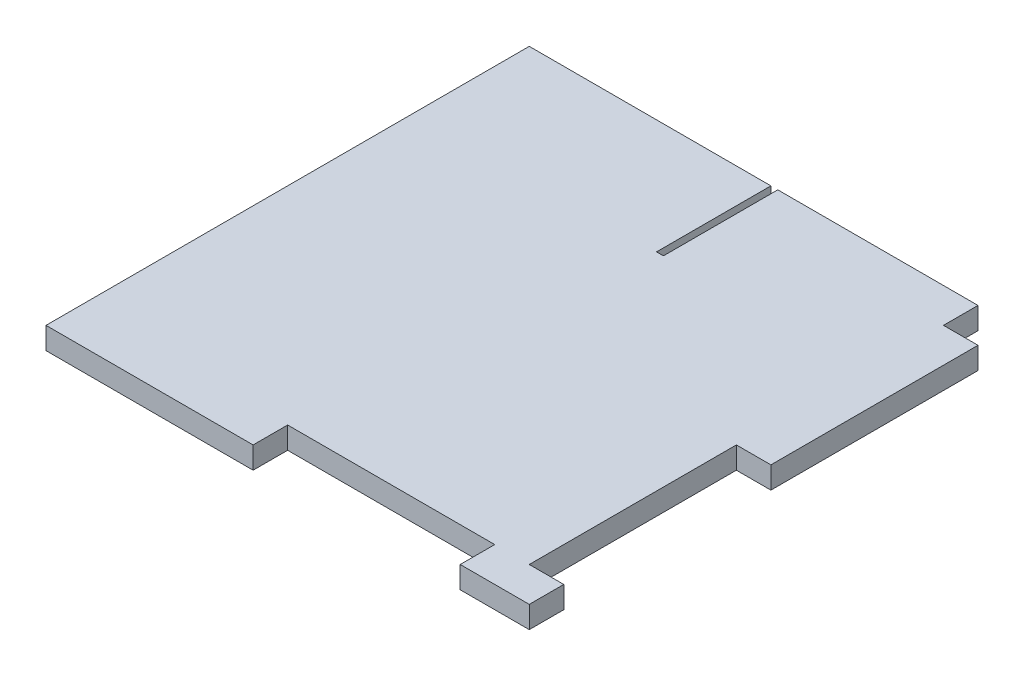
ISO-10303-21;
HEADER;
FILE_DESCRIPTION(('STEP AP214'),'2;1');
FILE_NAME('part.step','',(''),(''),'','','');
FILE_SCHEMA(('AUTOMOTIVE_DESIGN { 1 0 10303 214 1 1 1 1 }'));
ENDSEC;
DATA;
#1=APPLICATION_CONTEXT('core data for automotive mechanical design processes');
#2=APPLICATION_PROTOCOL_DEFINITION('international standard','automotive_design',2000,#1);
#3=PRODUCT_CONTEXT('',#1,'mechanical');
#4=PRODUCT('Part','Part','',(#3));
#5=PRODUCT_RELATED_PRODUCT_CATEGORY('part','',(#4));
#6=PRODUCT_DEFINITION_FORMATION('','',#4);
#7=PRODUCT_DEFINITION_CONTEXT('part definition',#1,'design');
#8=PRODUCT_DEFINITION('design','',#6,#7);
#9=PRODUCT_DEFINITION_SHAPE('','',#8);
#10=(LENGTH_UNIT() NAMED_UNIT(*) SI_UNIT(.MILLI.,.METRE.));
#11=(NAMED_UNIT(*) PLANE_ANGLE_UNIT() SI_UNIT($,.RADIAN.));
#12=(NAMED_UNIT(*) SI_UNIT($,.STERADIAN.) SOLID_ANGLE_UNIT());
#13=UNCERTAINTY_MEASURE_WITH_UNIT(LENGTH_MEASURE(1.E-05),#10,'distance_accuracy_value','');
#14=(GEOMETRIC_REPRESENTATION_CONTEXT(3) GLOBAL_UNCERTAINTY_ASSIGNED_CONTEXT((#13)) GLOBAL_UNIT_ASSIGNED_CONTEXT((#10,
#11,#12)) REPRESENTATION_CONTEXT('',''));
#15=CARTESIAN_POINT('',(0.,0.,0.));
#16=DIRECTION('',(0.,0.,1.));
#17=DIRECTION('',(1.,0.,0.));
#18=AXIS2_PLACEMENT_3D('',#15,#16,#17);
#19=CARTESIAN_POINT('',(35.,3.175,35.));
#20=DIRECTION('',(-1.,0.,0.));
#21=DIRECTION('',(0.,0.,1.));
#22=AXIS2_PLACEMENT_3D('',#19,#20,#21);
#23=PLANE('',#22);
#24=DIRECTION('',(0.,0.,-1.));
#25=VECTOR('',#24,1.);
#26=CARTESIAN_POINT('',(35.,3.175,35.));
#27=LINE('',#26,#25);
#28=CARTESIAN_POINT('',(35.,3.175,0.));
#29=VERTEX_POINT('',#28);
#30=CARTESIAN_POINT('',(35.,3.175,-30.));
#31=VERTEX_POINT('',#30);
#32=EDGE_CURVE('E202',#29,#31,#27,.T.);
#33=ORIENTED_EDGE('',*,*,#32,.F.);
#34=DIRECTION('',(0.,1.,0.));
#35=VECTOR('',#34,1.);
#36=CARTESIAN_POINT('',(35.,-6.825,0.));
#37=LINE('',#36,#35);
#38=CARTESIAN_POINT('',(35.,0.,0.));
#39=VERTEX_POINT('',#38);
#40=EDGE_CURVE('E250',#39,#29,#37,.T.);
#41=ORIENTED_EDGE('',*,*,#40,.F.);
#42=DIRECTION('',(0.,0.,-1.));
#43=VECTOR('',#42,1.);
#44=CARTESIAN_POINT('',(35.,0.,35.));
#45=LINE('',#44,#43);
#46=CARTESIAN_POINT('',(35.,0.,-30.));
#47=VERTEX_POINT('',#46);
#48=EDGE_CURVE('E193',#39,#47,#45,.T.);
#49=ORIENTED_EDGE('',*,*,#48,.T.);
#50=DIRECTION('',(0.,1.,0.));
#51=VECTOR('',#50,1.);
#52=CARTESIAN_POINT('',(35.,-6.825,-30.));
#53=LINE('',#52,#51);
#54=EDGE_CURVE('E55',#47,#31,#53,.T.);
#55=ORIENTED_EDGE('',*,*,#54,.T.);
#56=EDGE_LOOP('',(#33,#41,#49,#55));
#57=FACE_BOUND('',#56,.T.);
#58=ADVANCED_FACE('F33',(#57),#23,.F.);
#59=CARTESIAN_POINT('',(35.,0.,35.));
#60=VERTEX_POINT('',#59);
#61=CARTESIAN_POINT('',(35.,0.,30.));
#62=VERTEX_POINT('',#61);
#63=EDGE_CURVE('E189',#60,#62,#45,.T.);
#64=ORIENTED_EDGE('',*,*,#63,.T.);
#65=DIRECTION('',(0.,1.,0.));
#66=VECTOR('',#65,1.);
#67=CARTESIAN_POINT('',(35.,-6.825,30.));
#68=LINE('',#67,#66);
#69=CARTESIAN_POINT('',(35.,3.175,30.));
#70=VERTEX_POINT('',#69);
#71=EDGE_CURVE('E252',#62,#70,#68,.T.);
#72=ORIENTED_EDGE('',*,*,#71,.T.);
#73=CARTESIAN_POINT('',(35.,3.175,35.));
#74=VERTEX_POINT('',#73);
#75=EDGE_CURVE('E292',#74,#70,#27,.T.);
#76=ORIENTED_EDGE('',*,*,#75,.F.);
#77=DIRECTION('',(0.,-1.,0.));
#78=VECTOR('',#77,1.);
#79=CARTESIAN_POINT('',(35.,3.175,35.));
#80=LINE('',#79,#78);
#81=EDGE_CURVE('E179',#74,#60,#80,.T.);
#82=ORIENTED_EDGE('',*,*,#81,.T.);
#83=EDGE_LOOP('',(#64,#72,#76,#82));
#84=FACE_BOUND('',#83,.T.);
#85=ADVANCED_FACE('F326',(#84),#23,.F.);
#86=CARTESIAN_POINT('',(-35.,3.175,-35.));
#87=DIRECTION('',(0.,0.,1.));
#88=DIRECTION('',(1.,0.,0.));
#89=AXIS2_PLACEMENT_3D('',#86,#87,#88);
#90=PLANE('',#89);
#91=DIRECTION('',(0.,1.,0.));
#92=VECTOR('',#91,1.);
#93=CARTESIAN_POINT('',(30.,-6.825,-35.));
#94=LINE('',#93,#92);
#95=CARTESIAN_POINT('',(30.,0.,-35.));
#96=VERTEX_POINT('',#95);
#97=CARTESIAN_POINT('',(30.,3.175,-35.));
#98=VERTEX_POINT('',#97);
#99=EDGE_CURVE('E243',#96,#98,#94,.T.);
#100=ORIENTED_EDGE('',*,*,#99,.F.);
#101=DIRECTION('',(-1.,0.,0.));
#102=VECTOR('',#101,1.);
#103=CARTESIAN_POINT('',(-35.,0.,-35.));
#104=LINE('',#103,#102);
#105=CARTESIAN_POINT('',(1.,0.,-35.));
#106=VERTEX_POINT('',#105);
#107=EDGE_CURVE('E194',#96,#106,#104,.T.);
#108=ORIENTED_EDGE('',*,*,#107,.T.);
#109=DIRECTION('',(0.,1.,0.));
#110=VECTOR('',#109,1.);
#111=CARTESIAN_POINT('',(1.,0.,-35.));
#112=LINE('',#111,#110);
#113=CARTESIAN_POINT('',(1.,3.175,-35.));
#114=VERTEX_POINT('',#113);
#115=EDGE_CURVE('E286',#106,#114,#112,.T.);
#116=ORIENTED_EDGE('',*,*,#115,.T.);
#117=DIRECTION('',(-1.,0.,0.));
#118=VECTOR('',#117,1.);
#119=CARTESIAN_POINT('',(-35.,3.175,-35.));
#120=LINE('',#119,#118);
#121=EDGE_CURVE('E185',#98,#114,#120,.T.);
#122=ORIENTED_EDGE('',*,*,#121,.F.);
#123=EDGE_LOOP('',(#100,#108,#116,#122));
#124=FACE_BOUND('',#123,.T.);
#125=ADVANCED_FACE('F332',(#124),#90,.F.);
#126=CARTESIAN_POINT('',(-35.,3.175,35.));
#127=DIRECTION('',(0.,0.,-1.));
#128=DIRECTION('',(-1.,0.,0.));
#129=AXIS2_PLACEMENT_3D('',#126,#127,#128);
#130=PLANE('',#129);
#131=DIRECTION('',(0.,1.,0.));
#132=VECTOR('',#131,1.);
#133=CARTESIAN_POINT('',(-5.,-6.825,35.));
#134=LINE('',#133,#132);
#135=CARTESIAN_POINT('',(-5.,0.,35.));
#136=VERTEX_POINT('',#135);
#137=CARTESIAN_POINT('',(-5.,3.175,35.));
#138=VERTEX_POINT('',#137);
#139=EDGE_CURVE('E231',#136,#138,#134,.T.);
#140=ORIENTED_EDGE('',*,*,#139,.T.);
#141=DIRECTION('',(1.,0.,0.));
#142=VECTOR('',#141,1.);
#143=CARTESIAN_POINT('',(-35.,3.175,35.));
#144=LINE('',#143,#142);
#145=CARTESIAN_POINT('',(-35.,3.175,35.));
#146=VERTEX_POINT('',#145);
#147=EDGE_CURVE('E181',#146,#138,#144,.T.);
#148=ORIENTED_EDGE('',*,*,#147,.F.);
#149=DIRECTION('',(0.,-1.,0.));
#150=VECTOR('',#149,1.);
#151=CARTESIAN_POINT('',(-35.,3.175,35.));
#152=LINE('',#151,#150);
#153=CARTESIAN_POINT('',(-35.,0.,35.));
#154=VERTEX_POINT('',#153);
#155=EDGE_CURVE('E204',#146,#154,#152,.T.);
#156=ORIENTED_EDGE('',*,*,#155,.T.);
#157=DIRECTION('',(1.,0.,0.));
#158=VECTOR('',#157,1.);
#159=CARTESIAN_POINT('',(-35.,0.,35.));
#160=LINE('',#159,#158);
#161=EDGE_CURVE('E199',#154,#136,#160,.T.);
#162=ORIENTED_EDGE('',*,*,#161,.T.);
#163=EDGE_LOOP('',(#140,#148,#156,#162));
#164=FACE_BOUND('',#163,.T.);
#165=ADVANCED_FACE('F311',(#164),#130,.F.);
#166=CARTESIAN_POINT('',(0.,3.175,0.));
#167=DIRECTION('',(0.,-1.,0.));
#168=DIRECTION('',(0.,0.,-1.));
#169=AXIS2_PLACEMENT_3D('',#166,#167,#168);
#170=PLANE('',#169);
#171=DIRECTION('',(0.,0.,-1.));
#172=VECTOR('',#171,1.);
#173=CARTESIAN_POINT('',(-5.,3.175,0.));
#174=LINE('',#173,#172);
#175=CARTESIAN_POINT('',(-5.,3.175,30.));
#176=VERTEX_POINT('',#175);
#177=EDGE_CURVE('E165',#138,#176,#174,.T.);
#178=ORIENTED_EDGE('',*,*,#177,.T.);
#179=DIRECTION('',(1.,0.,0.));
#180=VECTOR('',#179,1.);
#181=CARTESIAN_POINT('',(0.,3.175,30.));
#182=LINE('',#181,#180);
#183=CARTESIAN_POINT('',(25.,3.175,30.));
#184=VERTEX_POINT('',#183);
#185=EDGE_CURVE('E174',#176,#184,#182,.T.);
#186=ORIENTED_EDGE('',*,*,#185,.T.);
#187=DIRECTION('',(0.,0.,-1.));
#188=VECTOR('',#187,1.);
#189=CARTESIAN_POINT('',(25.,3.175,0.));
#190=LINE('',#189,#188);
#191=CARTESIAN_POINT('',(25.,3.175,35.));
#192=VERTEX_POINT('',#191);
#193=EDGE_CURVE('E158',#192,#184,#190,.T.);
#194=ORIENTED_EDGE('',*,*,#193,.F.);
#195=EDGE_CURVE('E171',#192,#74,#144,.T.);
#196=ORIENTED_EDGE('',*,*,#195,.T.);
#197=ORIENTED_EDGE('',*,*,#75,.T.);
#198=DIRECTION('',(1.,0.,0.));
#199=VECTOR('',#198,1.);
#200=CARTESIAN_POINT('',(0.,3.175,30.));
#201=LINE('',#200,#199);
#202=CARTESIAN_POINT('',(30.,3.175,30.));
#203=VERTEX_POINT('',#202);
#204=EDGE_CURVE('E242',#203,#70,#201,.T.);
#205=ORIENTED_EDGE('',*,*,#204,.F.);
#206=DIRECTION('',(0.,0.,-1.));
#207=VECTOR('',#206,1.);
#208=CARTESIAN_POINT('',(30.,3.175,0.));
#209=LINE('',#208,#207);
#210=CARTESIAN_POINT('',(30.,3.175,0.));
#211=VERTEX_POINT('',#210);
#212=EDGE_CURVE('E239',#203,#211,#209,.T.);
#213=ORIENTED_EDGE('',*,*,#212,.T.);
#214=DIRECTION('',(-1.,0.,0.));
#215=VECTOR('',#214,1.);
#216=CARTESIAN_POINT('',(0.,3.175,0.));
#217=LINE('',#216,#215);
#218=EDGE_CURVE('E245',#29,#211,#217,.T.);
#219=ORIENTED_EDGE('',*,*,#218,.F.);
#220=ORIENTED_EDGE('',*,*,#32,.T.);
#221=DIRECTION('',(-1.,0.,0.));
#222=VECTOR('',#221,1.);
#223=CARTESIAN_POINT('',(0.,3.175,-30.));
#224=LINE('',#223,#222);
#225=CARTESIAN_POINT('',(30.,3.175,-30.));
#226=VERTEX_POINT('',#225);
#227=EDGE_CURVE('E259',#31,#226,#224,.T.);
#228=ORIENTED_EDGE('',*,*,#227,.T.);
#229=DIRECTION('',(0.,0.,-1.));
#230=VECTOR('',#229,1.);
#231=CARTESIAN_POINT('',(30.,3.175,0.));
#232=LINE('',#231,#230);
#233=EDGE_CURVE('E256',#226,#98,#232,.T.);
#234=ORIENTED_EDGE('',*,*,#233,.T.);
#235=ORIENTED_EDGE('',*,*,#121,.T.);
#236=DIRECTION('',(0.,0.,-1.));
#237=VECTOR('',#236,1.);
#238=CARTESIAN_POINT('',(1.,3.175,-35.));
#239=LINE('',#238,#237);
#240=CARTESIAN_POINT('',(1.,3.175,-18.4362981700651));
#241=VERTEX_POINT('',#240);
#242=EDGE_CURVE('E270',#241,#114,#239,.T.);
#243=ORIENTED_EDGE('',*,*,#242,.F.);
#244=DIRECTION('',(1.,0.,0.));
#245=VECTOR('',#244,1.);
#246=CARTESIAN_POINT('',(0.,3.175,-18.4362981700651));
#247=LINE('',#246,#245);
#248=CARTESIAN_POINT('',(0.,3.175,-18.4362981700651));
#249=VERTEX_POINT('',#248);
#250=EDGE_CURVE('E279',#249,#241,#247,.T.);
#251=ORIENTED_EDGE('',*,*,#250,.F.);
#252=DIRECTION('',(0.,0.,1.));
#253=VECTOR('',#252,1.);
#254=CARTESIAN_POINT('',(0.,3.175,-35.));
#255=LINE('',#254,#253);
#256=CARTESIAN_POINT('',(0.,3.175,-35.));
#257=VERTEX_POINT('',#256);
#258=EDGE_CURVE('E234',#257,#249,#255,.T.);
#259=ORIENTED_EDGE('',*,*,#258,.F.);
#260=CARTESIAN_POINT('',(-35.,3.175,-35.));
#261=VERTEX_POINT('',#260);
#262=EDGE_CURVE('E293',#257,#261,#120,.T.);
#263=ORIENTED_EDGE('',*,*,#262,.T.);
#264=DIRECTION('',(0.,0.,1.));
#265=VECTOR('',#264,1.);
#266=CARTESIAN_POINT('',(-35.,3.175,35.));
#267=LINE('',#266,#265);
#268=EDGE_CURVE('E182',#261,#146,#267,.T.);
#269=ORIENTED_EDGE('',*,*,#268,.T.);
#270=ORIENTED_EDGE('',*,*,#147,.T.);
#271=EDGE_LOOP('',(#178,#186,#194,#196,#197,#205,#213,#219,#220,#228,#234,#235,#243,#251,#259,
#263,#269,#270));
#272=FACE_BOUND('',#271,.T.);
#273=ADVANCED_FACE('F169',(#272),#170,.F.);
#274=CARTESIAN_POINT('',(0.,0.,0.));
#275=DIRECTION('',(0.,-1.,0.));
#276=DIRECTION('',(0.,0.,-1.));
#277=AXIS2_PLACEMENT_3D('',#274,#275,#276);
#278=PLANE('',#277);
#279=DIRECTION('',(-1.,0.,0.));
#280=VECTOR('',#279,1.);
#281=CARTESIAN_POINT('',(0.,0.,30.));
#282=LINE('',#281,#280);
#283=CARTESIAN_POINT('',(25.,0.,30.));
#284=VERTEX_POINT('',#283);
#285=CARTESIAN_POINT('',(-5.,0.,30.));
#286=VERTEX_POINT('',#285);
#287=EDGE_CURVE('E40',#284,#286,#282,.T.);
#288=ORIENTED_EDGE('',*,*,#287,.T.);
#289=DIRECTION('',(0.,0.,1.));
#290=VECTOR('',#289,1.);
#291=CARTESIAN_POINT('',(-5.,0.,0.));
#292=LINE('',#291,#290);
#293=EDGE_CURVE('E11',#286,#136,#292,.T.);
#294=ORIENTED_EDGE('',*,*,#293,.T.);
#295=ORIENTED_EDGE('',*,*,#161,.F.);
#296=DIRECTION('',(0.,0.,1.));
#297=VECTOR('',#296,1.);
#298=CARTESIAN_POINT('',(-35.,0.,35.));
#299=LINE('',#298,#297);
#300=CARTESIAN_POINT('',(-35.,0.,-35.));
#301=VERTEX_POINT('',#300);
#302=EDGE_CURVE('E196',#301,#154,#299,.T.);
#303=ORIENTED_EDGE('',*,*,#302,.F.);
#304=CARTESIAN_POINT('',(0.,0.,-35.));
#305=VERTEX_POINT('',#304);
#306=EDGE_CURVE('E192',#305,#301,#104,.T.);
#307=ORIENTED_EDGE('',*,*,#306,.F.);
#308=DIRECTION('',(0.,0.,1.));
#309=VECTOR('',#308,1.);
#310=CARTESIAN_POINT('',(0.,0.,-35.));
#311=LINE('',#310,#309);
#312=CARTESIAN_POINT('',(0.,0.,-18.4362981700651));
#313=VERTEX_POINT('',#312);
#314=EDGE_CURVE('E266',#305,#313,#311,.T.);
#315=ORIENTED_EDGE('',*,*,#314,.T.);
#316=DIRECTION('',(1.,0.,0.));
#317=VECTOR('',#316,1.);
#318=CARTESIAN_POINT('',(0.,0.,-18.4362981700651));
#319=LINE('',#318,#317);
#320=CARTESIAN_POINT('',(1.,0.,-18.4362981700651));
#321=VERTEX_POINT('',#320);
#322=EDGE_CURVE('E269',#313,#321,#319,.T.);
#323=ORIENTED_EDGE('',*,*,#322,.T.);
#324=DIRECTION('',(0.,0.,-1.));
#325=VECTOR('',#324,1.);
#326=CARTESIAN_POINT('',(1.,0.,-35.));
#327=LINE('',#326,#325);
#328=EDGE_CURVE('E273',#321,#106,#327,.T.);
#329=ORIENTED_EDGE('',*,*,#328,.T.);
#330=ORIENTED_EDGE('',*,*,#107,.F.);
#331=DIRECTION('',(0.,0.,1.));
#332=VECTOR('',#331,1.);
#333=CARTESIAN_POINT('',(30.,0.,0.));
#334=LINE('',#333,#332);
#335=CARTESIAN_POINT('',(30.,0.,-30.));
#336=VERTEX_POINT('',#335);
#337=EDGE_CURVE('E212',#96,#336,#334,.T.);
#338=ORIENTED_EDGE('',*,*,#337,.T.);
#339=DIRECTION('',(1.,0.,0.));
#340=VECTOR('',#339,1.);
#341=CARTESIAN_POINT('',(0.,0.,-30.));
#342=LINE('',#341,#340);
#343=EDGE_CURVE('E210',#336,#47,#342,.T.);
#344=ORIENTED_EDGE('',*,*,#343,.T.);
#345=ORIENTED_EDGE('',*,*,#48,.F.);
#346=DIRECTION('',(1.,0.,0.));
#347=VECTOR('',#346,1.);
#348=CARTESIAN_POINT('',(0.,0.,0.));
#349=LINE('',#348,#347);
#350=CARTESIAN_POINT('',(30.,0.,0.));
#351=VERTEX_POINT('',#350);
#352=EDGE_CURVE('E220',#351,#39,#349,.T.);
#353=ORIENTED_EDGE('',*,*,#352,.F.);
#354=DIRECTION('',(0.,0.,1.));
#355=VECTOR('',#354,1.);
#356=CARTESIAN_POINT('',(30.,0.,0.));
#357=LINE('',#356,#355);
#358=CARTESIAN_POINT('',(30.,0.,30.));
#359=VERTEX_POINT('',#358);
#360=EDGE_CURVE('E217',#351,#359,#357,.T.);
#361=ORIENTED_EDGE('',*,*,#360,.T.);
#362=DIRECTION('',(-1.,0.,0.));
#363=VECTOR('',#362,1.);
#364=CARTESIAN_POINT('',(0.,0.,30.));
#365=LINE('',#364,#363);
#366=EDGE_CURVE('E215',#62,#359,#365,.T.);
#367=ORIENTED_EDGE('',*,*,#366,.F.);
#368=ORIENTED_EDGE('',*,*,#63,.F.);
#369=CARTESIAN_POINT('',(25.,0.,35.));
#370=VERTEX_POINT('',#369);
#371=EDGE_CURVE('E198',#370,#60,#160,.T.);
#372=ORIENTED_EDGE('',*,*,#371,.F.);
#373=DIRECTION('',(0.,0.,1.));
#374=VECTOR('',#373,1.);
#375=CARTESIAN_POINT('',(25.,0.,0.));
#376=LINE('',#375,#374);
#377=EDGE_CURVE('E161',#284,#370,#376,.T.);
#378=ORIENTED_EDGE('',*,*,#377,.F.);
#379=EDGE_LOOP('',(#288,#294,#295,#303,#307,#315,#323,#329,#330,#338,#344,#345,#353,#361,#367,
#368,#372,#378));
#380=FACE_BOUND('',#379,.T.);
#381=ADVANCED_FACE('F224',(#380),#278,.T.);
#382=ORIENTED_EDGE('',*,*,#262,.F.);
#383=DIRECTION('',(0.,1.,0.));
#384=VECTOR('',#383,1.);
#385=CARTESIAN_POINT('',(0.,0.,-35.));
#386=LINE('',#385,#384);
#387=EDGE_CURVE('E284',#305,#257,#386,.T.);
#388=ORIENTED_EDGE('',*,*,#387,.F.);
#389=ORIENTED_EDGE('',*,*,#306,.T.);
#390=DIRECTION('',(0.,-1.,0.));
#391=VECTOR('',#390,1.);
#392=CARTESIAN_POINT('',(-35.,3.175,-35.));
#393=LINE('',#392,#391);
#394=EDGE_CURVE('E207',#261,#301,#393,.T.);
#395=ORIENTED_EDGE('',*,*,#394,.F.);
#396=EDGE_LOOP('',(#382,#388,#389,#395));
#397=FACE_BOUND('',#396,.T.);
#398=ADVANCED_FACE('F304',(#397),#90,.F.);
#399=CARTESIAN_POINT('',(-35.,3.175,35.));
#400=DIRECTION('',(1.,0.,0.));
#401=DIRECTION('',(0.,0.,-1.));
#402=AXIS2_PLACEMENT_3D('',#399,#400,#401);
#403=PLANE('',#402);
#404=ORIENTED_EDGE('',*,*,#302,.T.);
#405=ORIENTED_EDGE('',*,*,#155,.F.);
#406=ORIENTED_EDGE('',*,*,#268,.F.);
#407=ORIENTED_EDGE('',*,*,#394,.T.);
#408=EDGE_LOOP('',(#404,#405,#406,#407));
#409=FACE_BOUND('',#408,.T.);
#410=ADVANCED_FACE('F308',(#409),#403,.F.);
#411=ORIENTED_EDGE('',*,*,#195,.F.);
#412=DIRECTION('',(0.,1.,0.));
#413=VECTOR('',#412,1.);
#414=CARTESIAN_POINT('',(25.,-6.825,35.));
#415=LINE('',#414,#413);
#416=EDGE_CURVE('E155',#370,#192,#415,.T.);
#417=ORIENTED_EDGE('',*,*,#416,.F.);
#418=ORIENTED_EDGE('',*,*,#371,.T.);
#419=ORIENTED_EDGE('',*,*,#81,.F.);
#420=EDGE_LOOP('',(#411,#417,#418,#419));
#421=FACE_BOUND('',#420,.T.);
#422=ADVANCED_FACE('F177',(#421),#130,.F.);
#423=CARTESIAN_POINT('',(0.,0.,-35.));
#424=DIRECTION('',(-1.,0.,0.));
#425=DIRECTION('',(0.,0.,1.));
#426=AXIS2_PLACEMENT_3D('',#423,#424,#425);
#427=PLANE('',#426);
#428=ORIENTED_EDGE('',*,*,#258,.T.);
#429=DIRECTION('',(0.,1.,0.));
#430=VECTOR('',#429,1.);
#431=CARTESIAN_POINT('',(0.,0.,-18.4362981700651));
#432=LINE('',#431,#430);
#433=EDGE_CURVE('E276',#313,#249,#432,.T.);
#434=ORIENTED_EDGE('',*,*,#433,.F.);
#435=ORIENTED_EDGE('',*,*,#314,.F.);
#436=ORIENTED_EDGE('',*,*,#387,.T.);
#437=EDGE_LOOP('',(#428,#434,#435,#436));
#438=FACE_BOUND('',#437,.T.);
#439=ADVANCED_FACE('F362',(#438),#427,.F.);
#440=CARTESIAN_POINT('',(1.,0.,-35.));
#441=DIRECTION('',(1.,0.,0.));
#442=DIRECTION('',(0.,0.,-1.));
#443=AXIS2_PLACEMENT_3D('',#440,#441,#442);
#444=PLANE('',#443);
#445=ORIENTED_EDGE('',*,*,#242,.T.);
#446=ORIENTED_EDGE('',*,*,#115,.F.);
#447=ORIENTED_EDGE('',*,*,#328,.F.);
#448=DIRECTION('',(0.,1.,0.));
#449=VECTOR('',#448,1.);
#450=CARTESIAN_POINT('',(1.,0.,-18.4362981700651));
#451=LINE('',#450,#449);
#452=EDGE_CURVE('E289',#321,#241,#451,.T.);
#453=ORIENTED_EDGE('',*,*,#452,.T.);
#454=EDGE_LOOP('',(#445,#446,#447,#453));
#455=FACE_BOUND('',#454,.T.);
#456=ADVANCED_FACE('F356',(#455),#444,.F.);
#457=CARTESIAN_POINT('',(0.,0.,-18.4362981700651));
#458=DIRECTION('',(0.,0.,1.));
#459=DIRECTION('',(1.,0.,0.));
#460=AXIS2_PLACEMENT_3D('',#457,#458,#459);
#461=PLANE('',#460);
#462=ORIENTED_EDGE('',*,*,#250,.T.);
#463=ORIENTED_EDGE('',*,*,#452,.F.);
#464=ORIENTED_EDGE('',*,*,#322,.F.);
#465=ORIENTED_EDGE('',*,*,#433,.T.);
#466=EDGE_LOOP('',(#462,#463,#464,#465));
#467=FACE_BOUND('',#466,.T.);
#468=ADVANCED_FACE('F360',(#467),#461,.F.);
#469=CARTESIAN_POINT('',(30.,-6.825,0.));
#470=DIRECTION('',(1.,0.,0.));
#471=DIRECTION('',(0.,0.,-1.));
#472=AXIS2_PLACEMENT_3D('',#469,#470,#471);
#473=PLANE('',#472);
#474=ORIENTED_EDGE('',*,*,#99,.T.);
#475=ORIENTED_EDGE('',*,*,#233,.F.);
#476=DIRECTION('',(0.,1.,0.));
#477=VECTOR('',#476,1.);
#478=CARTESIAN_POINT('',(30.,-6.825,-30.));
#479=LINE('',#478,#477);
#480=EDGE_CURVE('E262',#336,#226,#479,.T.);
#481=ORIENTED_EDGE('',*,*,#480,.F.);
#482=ORIENTED_EDGE('',*,*,#337,.F.);
#483=EDGE_LOOP('',(#474,#475,#481,#482));
#484=FACE_BOUND('',#483,.T.);
#485=ADVANCED_FACE('F351',(#484),#473,.T.);
#486=CARTESIAN_POINT('',(0.,-6.825,-30.));
#487=DIRECTION('',(0.,0.,-1.));
#488=DIRECTION('',(-1.,0.,0.));
#489=AXIS2_PLACEMENT_3D('',#486,#487,#488);
#490=PLANE('',#489);
#491=ORIENTED_EDGE('',*,*,#480,.T.);
#492=ORIENTED_EDGE('',*,*,#227,.F.);
#493=ORIENTED_EDGE('',*,*,#54,.F.);
#494=ORIENTED_EDGE('',*,*,#343,.F.);
#495=EDGE_LOOP('',(#491,#492,#493,#494));
#496=FACE_BOUND('',#495,.T.);
#497=ADVANCED_FACE('F348',(#496),#490,.T.);
#498=CARTESIAN_POINT('',(30.,-6.825,0.));
#499=DIRECTION('',(1.,0.,0.));
#500=DIRECTION('',(0.,0.,-1.));
#501=AXIS2_PLACEMENT_3D('',#498,#499,#500);
#502=PLANE('',#501);
#503=DIRECTION('',(0.,1.,0.));
#504=VECTOR('',#503,1.);
#505=CARTESIAN_POINT('',(30.,-6.825,0.));
#506=LINE('',#505,#504);
#507=EDGE_CURVE('E175',#351,#211,#506,.T.);
#508=ORIENTED_EDGE('',*,*,#507,.T.);
#509=ORIENTED_EDGE('',*,*,#212,.F.);
#510=DIRECTION('',(0.,1.,0.));
#511=VECTOR('',#510,1.);
#512=CARTESIAN_POINT('',(30.,-6.825,30.));
#513=LINE('',#512,#511);
#514=EDGE_CURVE('E248',#359,#203,#513,.T.);
#515=ORIENTED_EDGE('',*,*,#514,.F.);
#516=ORIENTED_EDGE('',*,*,#360,.F.);
#517=EDGE_LOOP('',(#508,#509,#515,#516));
#518=FACE_BOUND('',#517,.T.);
#519=ADVANCED_FACE('F414',(#518),#502,.T.);
#520=CARTESIAN_POINT('',(0.,-6.825,0.));
#521=DIRECTION('',(0.,0.,-1.));
#522=DIRECTION('',(-1.,0.,0.));
#523=AXIS2_PLACEMENT_3D('',#520,#521,#522);
#524=PLANE('',#523);
#525=ORIENTED_EDGE('',*,*,#352,.T.);
#526=ORIENTED_EDGE('',*,*,#40,.T.);
#527=ORIENTED_EDGE('',*,*,#218,.T.);
#528=ORIENTED_EDGE('',*,*,#507,.F.);
#529=EDGE_LOOP('',(#525,#526,#527,#528));
#530=FACE_BOUND('',#529,.T.);
#531=ADVANCED_FACE('F322',(#530),#524,.F.);
#532=CARTESIAN_POINT('',(0.,-6.825,30.));
#533=DIRECTION('',(0.,0.,1.));
#534=DIRECTION('',(1.,0.,0.));
#535=AXIS2_PLACEMENT_3D('',#532,#533,#534);
#536=PLANE('',#535);
#537=ORIENTED_EDGE('',*,*,#366,.T.);
#538=ORIENTED_EDGE('',*,*,#514,.T.);
#539=ORIENTED_EDGE('',*,*,#204,.T.);
#540=ORIENTED_EDGE('',*,*,#71,.F.);
#541=EDGE_LOOP('',(#537,#538,#539,#540));
#542=FACE_BOUND('',#541,.T.);
#543=ADVANCED_FACE('F315',(#542),#536,.F.);
#544=CARTESIAN_POINT('',(-5.,-6.825,0.));
#545=DIRECTION('',(1.,0.,0.));
#546=DIRECTION('',(0.,0.,-1.));
#547=AXIS2_PLACEMENT_3D('',#544,#545,#546);
#548=PLANE('',#547);
#549=DIRECTION('',(0.,1.,0.));
#550=VECTOR('',#549,1.);
#551=CARTESIAN_POINT('',(-5.,-6.825,30.));
#552=LINE('',#551,#550);
#553=EDGE_CURVE('E229',#286,#176,#552,.T.);
#554=ORIENTED_EDGE('',*,*,#553,.T.);
#555=ORIENTED_EDGE('',*,*,#177,.F.);
#556=ORIENTED_EDGE('',*,*,#139,.F.);
#557=ORIENTED_EDGE('',*,*,#293,.F.);
#558=EDGE_LOOP('',(#554,#555,#556,#557));
#559=FACE_BOUND('',#558,.T.);
#560=ADVANCED_FACE('F313',(#559),#548,.T.);
#561=CARTESIAN_POINT('',(0.,-6.825,30.));
#562=DIRECTION('',(0.,0.,1.));
#563=DIRECTION('',(1.,0.,0.));
#564=AXIS2_PLACEMENT_3D('',#561,#562,#563);
#565=PLANE('',#564);
#566=DIRECTION('',(0.,1.,0.));
#567=VECTOR('',#566,1.);
#568=CARTESIAN_POINT('',(25.,-6.825,30.));
#569=LINE('',#568,#567);
#570=EDGE_CURVE('E47',#284,#184,#569,.T.);
#571=ORIENTED_EDGE('',*,*,#570,.T.);
#572=ORIENTED_EDGE('',*,*,#185,.F.);
#573=ORIENTED_EDGE('',*,*,#553,.F.);
#574=ORIENTED_EDGE('',*,*,#287,.F.);
#575=EDGE_LOOP('',(#571,#572,#573,#574));
#576=FACE_BOUND('',#575,.T.);
#577=ADVANCED_FACE('F228',(#576),#565,.T.);
#578=CARTESIAN_POINT('',(25.,-6.825,0.));
#579=DIRECTION('',(1.,0.,0.));
#580=DIRECTION('',(0.,0.,-1.));
#581=AXIS2_PLACEMENT_3D('',#578,#579,#580);
#582=PLANE('',#581);
#583=ORIENTED_EDGE('',*,*,#377,.T.);
#584=ORIENTED_EDGE('',*,*,#416,.T.);
#585=ORIENTED_EDGE('',*,*,#193,.T.);
#586=ORIENTED_EDGE('',*,*,#570,.F.);
#587=EDGE_LOOP('',(#583,#584,#585,#586));
#588=FACE_BOUND('',#587,.T.);
#589=ADVANCED_FACE('F157',(#588),#582,.F.);
#590=CLOSED_SHELL('',(#58,#85,#125,#165,#273,#381,#398,#410,#422,#439,#456,#468,#485,#497,#519,
#531,#543,#560,#577,#589));
#591=MANIFOLD_SOLID_BREP('B2',#590);
#592=ADVANCED_BREP_SHAPE_REPRESENTATION('',(#18,#591),#14);
#593=SHAPE_DEFINITION_REPRESENTATION(#9,#592);
ENDSEC;
END-ISO-10303-21;
